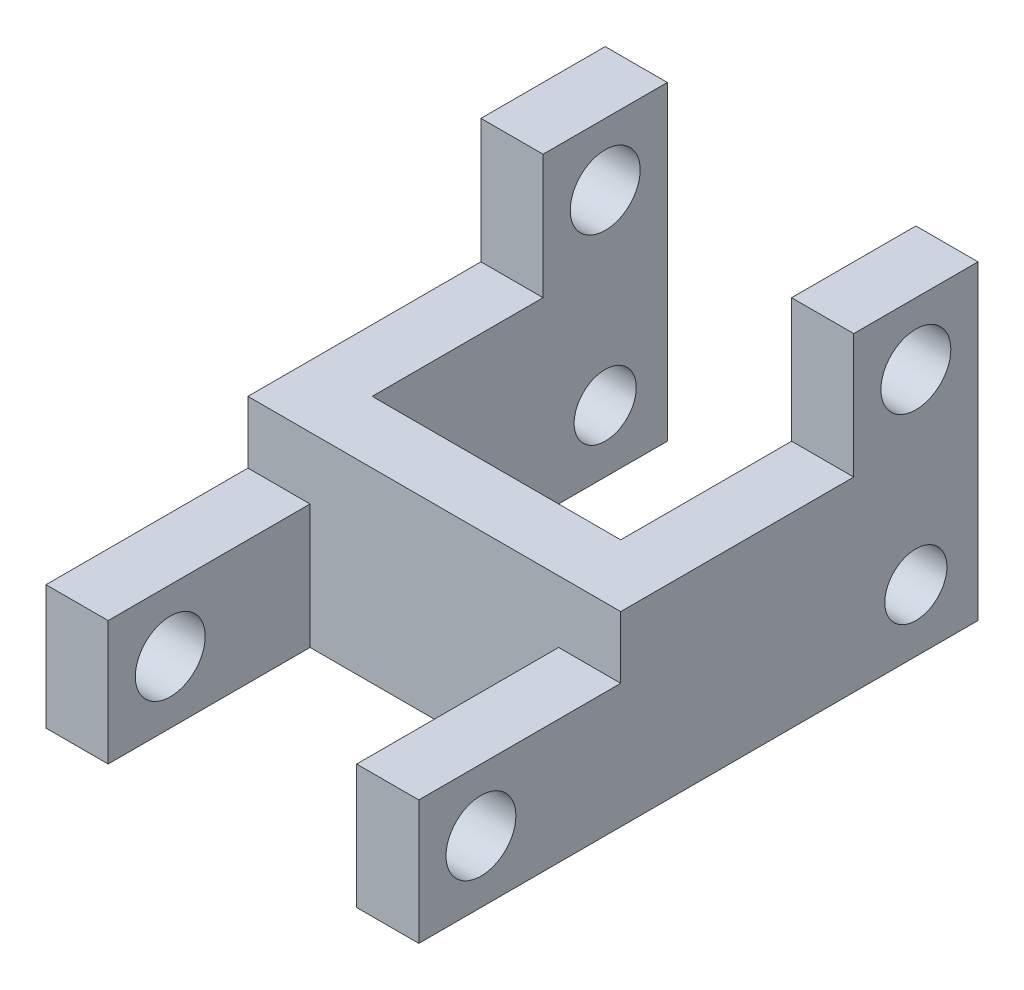
ISO-10303-21;
HEADER;
FILE_DESCRIPTION(('STEP AP214'),'2;1');
FILE_NAME('part.step','',(''),(''),'','','');
FILE_SCHEMA(('AUTOMOTIVE_DESIGN { 1 0 10303 214 1 1 1 1 }'));
ENDSEC;
DATA;
#1=APPLICATION_CONTEXT('core data for automotive mechanical design processes');
#2=APPLICATION_PROTOCOL_DEFINITION('international standard','automotive_design',2000,#1);
#3=PRODUCT_CONTEXT('',#1,'mechanical');
#4=PRODUCT('Part','Part','',(#3));
#5=PRODUCT_RELATED_PRODUCT_CATEGORY('part','',(#4));
#6=PRODUCT_DEFINITION_FORMATION('','',#4);
#7=PRODUCT_DEFINITION_CONTEXT('part definition',#1,'design');
#8=PRODUCT_DEFINITION('design','',#6,#7);
#9=PRODUCT_DEFINITION_SHAPE('','',#8);
#10=(LENGTH_UNIT() NAMED_UNIT(*) SI_UNIT(.MILLI.,.METRE.));
#11=(NAMED_UNIT(*) PLANE_ANGLE_UNIT() SI_UNIT($,.RADIAN.));
#12=(NAMED_UNIT(*) SI_UNIT($,.STERADIAN.) SOLID_ANGLE_UNIT());
#13=UNCERTAINTY_MEASURE_WITH_UNIT(LENGTH_MEASURE(1.E-05),#10,'distance_accuracy_value','');
#14=(GEOMETRIC_REPRESENTATION_CONTEXT(3) GLOBAL_UNCERTAINTY_ASSIGNED_CONTEXT((#13)) GLOBAL_UNIT_ASSIGNED_CONTEXT((#10,
#11,#12)) REPRESENTATION_CONTEXT('',''));
#15=CARTESIAN_POINT('',(0.,0.,0.));
#16=DIRECTION('',(0.,0.,1.));
#17=DIRECTION('',(1.,0.,0.));
#18=AXIS2_PLACEMENT_3D('',#15,#16,#17);
#19=CARTESIAN_POINT('',(0.,0.,0.));
#20=DIRECTION('',(1.,0.,0.));
#21=DIRECTION('',(0.,0.,-1.));
#22=AXIS2_PLACEMENT_3D('',#19,#20,#21);
#23=PLANE('',#22);
#24=CARTESIAN_POINT('',(0.,76.2,-177.8));
#25=DIRECTION('',(1.,0.,0.));
#26=DIRECTION('',(0.,0.,-1.));
#27=AXIS2_PLACEMENT_3D('',#24,#25,#26);
#28=CIRCLE('',#27,14.2875);
#29=CARTESIAN_POINT('',(0.,76.2,-192.0875));
#30=VERTEX_POINT('',#29);
#31=EDGE_CURVE('E335',#30,#30,#28,.T.);
#32=ORIENTED_EDGE('',*,*,#31,.T.);
#33=EDGE_LOOP('',(#32));
#34=FACE_BOUND('',#33,.T.);
#35=CARTESIAN_POINT('',(0.,0.,-177.8));
#36=DIRECTION('',(1.,0.,0.));
#37=DIRECTION('',(0.,0.,-1.));
#38=AXIS2_PLACEMENT_3D('',#35,#36,#37);
#39=CIRCLE('',#38,12.7);
#40=CARTESIAN_POINT('',(0.,0.,-190.5));
#41=VERTEX_POINT('',#40);
#42=EDGE_CURVE('E338',#41,#41,#39,.T.);
#43=ORIENTED_EDGE('',*,*,#42,.T.);
#44=EDGE_LOOP('',(#43));
#45=FACE_BOUND('',#44,.T.);
#46=DIRECTION('',(0.,-1.,0.));
#47=VECTOR('',#46,1.);
#48=CARTESIAN_POINT('',(0.,0.,-82.55));
#49=LINE('',#48,#47);
#50=CARTESIAN_POINT('',(0.,50.8,-82.55));
#51=VERTEX_POINT('',#50);
#52=CARTESIAN_POINT('',(0.,-25.4,-82.55));
#53=VERTEX_POINT('',#52);
#54=EDGE_CURVE('E296',#51,#53,#49,.T.);
#55=ORIENTED_EDGE('',*,*,#54,.F.);
#56=DIRECTION('',(0.,0.,-1.));
#57=VECTOR('',#56,1.);
#58=CARTESIAN_POINT('',(0.,50.8,0.));
#59=LINE('',#58,#57);
#60=CARTESIAN_POINT('',(0.,50.8,-152.4));
#61=VERTEX_POINT('',#60);
#62=EDGE_CURVE('E344',#51,#61,#59,.T.);
#63=ORIENTED_EDGE('',*,*,#62,.T.);
#64=DIRECTION('',(0.,1.,0.));
#65=VECTOR('',#64,1.);
#66=CARTESIAN_POINT('',(0.,0.,-152.4));
#67=LINE('',#66,#65);
#68=CARTESIAN_POINT('',(0.,101.6,-152.4));
#69=VERTEX_POINT('',#68);
#70=EDGE_CURVE('E347',#61,#69,#67,.T.);
#71=ORIENTED_EDGE('',*,*,#70,.T.);
#72=DIRECTION('',(0.,0.,1.));
#73=VECTOR('',#72,1.);
#74=CARTESIAN_POINT('',(0.,101.6,0.));
#75=LINE('',#74,#73);
#76=CARTESIAN_POINT('',(0.,101.6,-203.2));
#77=VERTEX_POINT('',#76);
#78=EDGE_CURVE('E351',#77,#69,#75,.T.);
#79=ORIENTED_EDGE('',*,*,#78,.F.);
#80=DIRECTION('',(0.,1.,0.));
#81=VECTOR('',#80,1.);
#82=CARTESIAN_POINT('',(0.,0.,-203.2));
#83=LINE('',#82,#81);
#84=CARTESIAN_POINT('',(0.,-25.4,-203.2));
#85=VERTEX_POINT('',#84);
#86=EDGE_CURVE('E320',#85,#77,#83,.T.);
#87=ORIENTED_EDGE('',*,*,#86,.F.);
#88=DIRECTION('',(0.,0.,-1.));
#89=VECTOR('',#88,1.);
#90=CARTESIAN_POINT('',(0.,-25.4,0.));
#91=LINE('',#90,#89);
#92=EDGE_CURVE('E309',#53,#85,#91,.T.);
#93=ORIENTED_EDGE('',*,*,#92,.F.);
#94=EDGE_LOOP('',(#55,#63,#71,#79,#87,#93));
#95=FACE_BOUND('',#94,.T.);
#96=ADVANCED_FACE('F35',(#34,#45,#95),#23,.F.);
#97=CARTESIAN_POINT('',(25.4,-25.4,0.));
#98=DIRECTION('',(0.,1.,0.));
#99=DIRECTION('',(0.,0.,1.));
#100=AXIS2_PLACEMENT_3D('',#97,#98,#99);
#101=PLANE('',#100);
#102=CARTESIAN_POINT('',(0.,-25.4,25.4));
#103=VERTEX_POINT('',#102);
#104=CARTESIAN_POINT('',(0.,-25.4,-57.15));
#105=VERTEX_POINT('',#104);
#106=EDGE_CURVE('E270',#103,#105,#91,.T.);
#107=ORIENTED_EDGE('',*,*,#106,.T.);
#108=DIRECTION('',(1.,0.,0.));
#109=VECTOR('',#108,1.);
#110=CARTESIAN_POINT('',(-101.6,-25.4,-57.15));
#111=LINE('',#110,#109);
#112=CARTESIAN_POINT('',(-101.6,-25.4,-57.15));
#113=VERTEX_POINT('',#112);
#114=EDGE_CURVE('E268',#113,#105,#111,.T.);
#115=ORIENTED_EDGE('',*,*,#114,.F.);
#116=DIRECTION('',(0.,0.,-1.));
#117=VECTOR('',#116,1.);
#118=CARTESIAN_POINT('',(-101.6,-25.4,0.));
#119=LINE('',#118,#117);
#120=CARTESIAN_POINT('',(-101.6,-25.4,25.4));
#121=VERTEX_POINT('',#120);
#122=EDGE_CURVE('E222',#121,#113,#119,.T.);
#123=ORIENTED_EDGE('',*,*,#122,.F.);
#124=DIRECTION('',(1.,0.,0.));
#125=VECTOR('',#124,1.);
#126=CARTESIAN_POINT('',(-127.,-25.4,25.4));
#127=LINE('',#126,#125);
#128=CARTESIAN_POINT('',(-127.,-25.4,25.4));
#129=VERTEX_POINT('',#128);
#130=EDGE_CURVE('E212',#129,#121,#127,.T.);
#131=ORIENTED_EDGE('',*,*,#130,.F.);
#132=DIRECTION('',(0.,0.,-1.));
#133=VECTOR('',#132,1.);
#134=CARTESIAN_POINT('',(-127.,-25.4,0.));
#135=LINE('',#134,#133);
#136=CARTESIAN_POINT('',(-127.,-25.4,-203.2));
#137=VERTEX_POINT('',#136);
#138=EDGE_CURVE('E187',#129,#137,#135,.T.);
#139=ORIENTED_EDGE('',*,*,#138,.T.);
#140=DIRECTION('',(1.,0.,0.));
#141=VECTOR('',#140,1.);
#142=CARTESIAN_POINT('',(-127.,-25.4,-203.2));
#143=LINE('',#142,#141);
#144=CARTESIAN_POINT('',(-101.6,-25.4,-203.2));
#145=VERTEX_POINT('',#144);
#146=EDGE_CURVE('E253',#137,#145,#143,.T.);
#147=ORIENTED_EDGE('',*,*,#146,.T.);
#148=CARTESIAN_POINT('',(-101.6,-25.4,-82.55));
#149=VERTEX_POINT('',#148);
#150=EDGE_CURVE('E226',#149,#145,#119,.T.);
#151=ORIENTED_EDGE('',*,*,#150,.F.);
#152=DIRECTION('',(1.,0.,0.));
#153=VECTOR('',#152,1.);
#154=CARTESIAN_POINT('',(-101.6,-25.4,-82.55));
#155=LINE('',#154,#153);
#156=EDGE_CURVE('E272',#149,#53,#155,.T.);
#157=ORIENTED_EDGE('',*,*,#156,.T.);
#158=ORIENTED_EDGE('',*,*,#92,.T.);
#159=DIRECTION('',(-1.,0.,0.));
#160=VECTOR('',#159,1.);
#161=CARTESIAN_POINT('',(25.4,-25.4,-203.2));
#162=LINE('',#161,#160);
#163=CARTESIAN_POINT('',(25.4,-25.4,-203.2));
#164=VERTEX_POINT('',#163);
#165=EDGE_CURVE('E11',#164,#85,#162,.T.);
#166=ORIENTED_EDGE('',*,*,#165,.F.);
#167=DIRECTION('',(0.,0.,-1.));
#168=VECTOR('',#167,1.);
#169=CARTESIAN_POINT('',(25.4,-25.4,0.));
#170=LINE('',#169,#168);
#171=CARTESIAN_POINT('',(25.4,-25.4,25.4));
#172=VERTEX_POINT('',#171);
#173=EDGE_CURVE('E720',#172,#164,#170,.T.);
#174=ORIENTED_EDGE('',*,*,#173,.F.);
#175=DIRECTION('',(-1.,0.,0.));
#176=VECTOR('',#175,1.);
#177=CARTESIAN_POINT('',(25.4,-25.4,25.4));
#178=LINE('',#177,#176);
#179=EDGE_CURVE('E333',#172,#103,#178,.T.);
#180=ORIENTED_EDGE('',*,*,#179,.T.);
#181=EDGE_LOOP('',(#107,#115,#123,#131,#139,#147,#151,#157,#158,#166,#174,#180));
#182=FACE_BOUND('',#181,.T.);
#183=ADVANCED_FACE('F266',(#182),#101,.F.);
#184=CARTESIAN_POINT('',(25.4,0.,-203.2));
#185=DIRECTION('',(0.,0.,1.));
#186=DIRECTION('',(1.,0.,0.));
#187=AXIS2_PLACEMENT_3D('',#184,#185,#186);
#188=PLANE('',#187);
#189=ORIENTED_EDGE('',*,*,#86,.T.);
#190=DIRECTION('',(-1.,0.,0.));
#191=VECTOR('',#190,1.);
#192=CARTESIAN_POINT('',(25.4,101.6,-203.2));
#193=LINE('',#192,#191);
#194=CARTESIAN_POINT('',(25.4,101.6,-203.2));
#195=VERTEX_POINT('',#194);
#196=EDGE_CURVE('E45',#195,#77,#193,.T.);
#197=ORIENTED_EDGE('',*,*,#196,.F.);
#198=DIRECTION('',(0.,1.,0.));
#199=VECTOR('',#198,1.);
#200=CARTESIAN_POINT('',(25.4,0.,-203.2));
#201=LINE('',#200,#199);
#202=EDGE_CURVE('E721',#164,#195,#201,.T.);
#203=ORIENTED_EDGE('',*,*,#202,.F.);
#204=ORIENTED_EDGE('',*,*,#165,.T.);
#205=EDGE_LOOP('',(#189,#197,#203,#204));
#206=FACE_BOUND('',#205,.T.);
#207=ADVANCED_FACE('F360',(#206),#188,.F.);
#208=CARTESIAN_POINT('',(25.4,101.6,0.));
#209=DIRECTION('',(0.,-1.,0.));
#210=DIRECTION('',(0.,0.,-1.));
#211=AXIS2_PLACEMENT_3D('',#208,#209,#210);
#212=PLANE('',#211);
#213=ORIENTED_EDGE('',*,*,#78,.T.);
#214=DIRECTION('',(-1.,0.,0.));
#215=VECTOR('',#214,1.);
#216=CARTESIAN_POINT('',(25.4,101.6,-152.4));
#217=LINE('',#216,#215);
#218=CARTESIAN_POINT('',(25.4,101.6,-152.4));
#219=VERTEX_POINT('',#218);
#220=EDGE_CURVE('E328',#219,#69,#217,.T.);
#221=ORIENTED_EDGE('',*,*,#220,.F.);
#222=DIRECTION('',(0.,0.,1.));
#223=VECTOR('',#222,1.);
#224=CARTESIAN_POINT('',(25.4,101.6,0.));
#225=LINE('',#224,#223);
#226=EDGE_CURVE('E364',#195,#219,#225,.T.);
#227=ORIENTED_EDGE('',*,*,#226,.F.);
#228=ORIENTED_EDGE('',*,*,#196,.T.);
#229=EDGE_LOOP('',(#213,#221,#227,#228));
#230=FACE_BOUND('',#229,.T.);
#231=ADVANCED_FACE('F363',(#230),#212,.F.);
#232=CARTESIAN_POINT('',(25.4,0.,-152.4));
#233=DIRECTION('',(0.,0.,1.));
#234=DIRECTION('',(1.,0.,0.));
#235=AXIS2_PLACEMENT_3D('',#232,#233,#234);
#236=PLANE('',#235);
#237=ORIENTED_EDGE('',*,*,#70,.F.);
#238=DIRECTION('',(-1.,0.,0.));
#239=VECTOR('',#238,1.);
#240=CARTESIAN_POINT('',(25.4,50.8,-152.4));
#241=LINE('',#240,#239);
#242=CARTESIAN_POINT('',(25.4,50.8,-152.4));
#243=VERTEX_POINT('',#242);
#244=EDGE_CURVE('E330',#243,#61,#241,.T.);
#245=ORIENTED_EDGE('',*,*,#244,.F.);
#246=DIRECTION('',(0.,1.,0.));
#247=VECTOR('',#246,1.);
#248=CARTESIAN_POINT('',(25.4,0.,-152.4));
#249=LINE('',#248,#247);
#250=EDGE_CURVE('E410',#243,#219,#249,.T.);
#251=ORIENTED_EDGE('',*,*,#250,.T.);
#252=ORIENTED_EDGE('',*,*,#220,.T.);
#253=EDGE_LOOP('',(#237,#245,#251,#252));
#254=FACE_BOUND('',#253,.T.);
#255=ADVANCED_FACE('F441',(#254),#236,.T.);
#256=CARTESIAN_POINT('',(25.4,50.8,0.));
#257=DIRECTION('',(0.,1.,0.));
#258=DIRECTION('',(0.,0.,1.));
#259=AXIS2_PLACEMENT_3D('',#256,#257,#258);
#260=PLANE('',#259);
#261=DIRECTION('',(1.,0.,0.));
#262=VECTOR('',#261,1.);
#263=CARTESIAN_POINT('',(-101.6,50.8,-57.15));
#264=LINE('',#263,#262);
#265=CARTESIAN_POINT('',(-127.,50.8,-57.15));
#266=VERTEX_POINT('',#265);
#267=CARTESIAN_POINT('',(25.4,50.8,-57.15));
#268=VERTEX_POINT('',#267);
#269=EDGE_CURVE('E273',#266,#268,#264,.T.);
#270=ORIENTED_EDGE('',*,*,#269,.T.);
#271=DIRECTION('',(0.,0.,-1.));
#272=VECTOR('',#271,1.);
#273=CARTESIAN_POINT('',(25.4,50.8,0.));
#274=LINE('',#273,#272);
#275=EDGE_CURVE('E408',#268,#243,#274,.T.);
#276=ORIENTED_EDGE('',*,*,#275,.T.);
#277=ORIENTED_EDGE('',*,*,#244,.T.);
#278=ORIENTED_EDGE('',*,*,#62,.F.);
#279=DIRECTION('',(1.,0.,0.));
#280=VECTOR('',#279,1.);
#281=CARTESIAN_POINT('',(-101.6,50.8,-82.55));
#282=LINE('',#281,#280);
#283=CARTESIAN_POINT('',(-101.6,50.8,-82.55));
#284=VERTEX_POINT('',#283);
#285=EDGE_CURVE('E276',#284,#51,#282,.T.);
#286=ORIENTED_EDGE('',*,*,#285,.F.);
#287=DIRECTION('',(0.,0.,-1.));
#288=VECTOR('',#287,1.);
#289=CARTESIAN_POINT('',(-101.6,50.8,0.));
#290=LINE('',#289,#288);
#291=CARTESIAN_POINT('',(-101.6,50.8,-152.4));
#292=VERTEX_POINT('',#291);
#293=EDGE_CURVE('E217',#284,#292,#290,.T.);
#294=ORIENTED_EDGE('',*,*,#293,.T.);
#295=DIRECTION('',(1.,0.,0.));
#296=VECTOR('',#295,1.);
#297=CARTESIAN_POINT('',(-127.,50.8,-152.4));
#298=LINE('',#297,#296);
#299=CARTESIAN_POINT('',(-127.,50.8,-152.4));
#300=VERTEX_POINT('',#299);
#301=EDGE_CURVE('E247',#300,#292,#298,.T.);
#302=ORIENTED_EDGE('',*,*,#301,.F.);
#303=DIRECTION('',(0.,0.,-1.));
#304=VECTOR('',#303,1.);
#305=CARTESIAN_POINT('',(-127.,50.8,0.));
#306=LINE('',#305,#304);
#307=EDGE_CURVE('E188',#266,#300,#306,.T.);
#308=ORIENTED_EDGE('',*,*,#307,.F.);
#309=EDGE_LOOP('',(#270,#276,#277,#278,#286,#294,#302,#308));
#310=FACE_BOUND('',#309,.T.);
#311=ADVANCED_FACE('F436',(#310),#260,.T.);
#312=CARTESIAN_POINT('',(25.4,0.,-177.8));
#313=DIRECTION('',(-1.,0.,0.));
#314=DIRECTION('',(0.,0.,1.));
#315=AXIS2_PLACEMENT_3D('',#312,#313,#314);
#316=CYLINDRICAL_SURFACE('',#315,12.7);
#317=CARTESIAN_POINT('',(25.4,0.,-177.8));
#318=DIRECTION('',(1.,0.,0.));
#319=DIRECTION('',(0.,0.,-1.));
#320=AXIS2_PLACEMENT_3D('',#317,#318,#319);
#321=CIRCLE('',#320,12.7);
#322=CARTESIAN_POINT('',(25.4,0.,-190.5));
#323=VERTEX_POINT('',#322);
#324=EDGE_CURVE('E414',#323,#323,#321,.T.);
#325=ORIENTED_EDGE('',*,*,#324,.T.);
#326=EDGE_LOOP('',(#325));
#327=FACE_BOUND('',#326,.T.);
#328=ORIENTED_EDGE('',*,*,#42,.F.);
#329=EDGE_LOOP('',(#328));
#330=FACE_BOUND('',#329,.T.);
#331=ADVANCED_FACE('F433',(#327,#330),#316,.F.);
#332=CARTESIAN_POINT('',(25.4,0.,25.4));
#333=DIRECTION('',(0.,0.,1.));
#334=DIRECTION('',(0.,-1.,0.));
#335=AXIS2_PLACEMENT_3D('',#332,#333,#334);
#336=PLANE('',#335);
#337=DIRECTION('',(1.,0.,0.));
#338=VECTOR('',#337,1.);
#339=CARTESIAN_POINT('',(-127.,25.4,25.4));
#340=LINE('',#339,#338);
#341=CARTESIAN_POINT('',(0.,25.4,25.4));
#342=VERTEX_POINT('',#341);
#343=CARTESIAN_POINT('',(25.4,25.4,25.4));
#344=VERTEX_POINT('',#343);
#345=EDGE_CURVE('E181',#342,#344,#340,.T.);
#346=ORIENTED_EDGE('',*,*,#345,.F.);
#347=DIRECTION('',(0.,1.,0.));
#348=VECTOR('',#347,1.);
#349=CARTESIAN_POINT('',(0.,0.,25.4));
#350=LINE('',#349,#348);
#351=EDGE_CURVE('E341',#103,#342,#350,.T.);
#352=ORIENTED_EDGE('',*,*,#351,.F.);
#353=ORIENTED_EDGE('',*,*,#179,.F.);
#354=DIRECTION('',(0.,1.,0.));
#355=VECTOR('',#354,1.);
#356=CARTESIAN_POINT('',(25.4,0.,25.4));
#357=LINE('',#356,#355);
#358=EDGE_CURVE('E394',#172,#344,#357,.T.);
#359=ORIENTED_EDGE('',*,*,#358,.T.);
#360=EDGE_LOOP('',(#346,#352,#353,#359));
#361=FACE_BOUND('',#360,.T.);
#362=ADVANCED_FACE('F390',(#361),#336,.T.);
#363=CARTESIAN_POINT('',(25.4,0.,0.));
#364=DIRECTION('',(-1.,0.,0.));
#365=DIRECTION('',(0.,0.,1.));
#366=AXIS2_PLACEMENT_3D('',#363,#364,#365);
#367=CYLINDRICAL_SURFACE('',#366,14.2875);
#368=CARTESIAN_POINT('',(25.4,0.,0.));
#369=DIRECTION('',(1.,0.,0.));
#370=DIRECTION('',(0.,0.,-1.));
#371=AXIS2_PLACEMENT_3D('',#368,#369,#370);
#372=CIRCLE('',#371,14.2875);
#373=CARTESIAN_POINT('',(25.4,0.,-14.2875));
#374=VERTEX_POINT('',#373);
#375=EDGE_CURVE('E293',#374,#374,#372,.T.);
#376=ORIENTED_EDGE('',*,*,#375,.T.);
#377=EDGE_LOOP('',(#376));
#378=FACE_BOUND('',#377,.T.);
#379=CARTESIAN_POINT('',(0.,0.,0.));
#380=DIRECTION('',(1.,0.,0.));
#381=DIRECTION('',(0.,0.,-1.));
#382=AXIS2_PLACEMENT_3D('',#379,#380,#381);
#383=CIRCLE('',#382,14.2875);
#384=CARTESIAN_POINT('',(0.,0.,-14.2875));
#385=VERTEX_POINT('',#384);
#386=EDGE_CURVE('E303',#385,#385,#383,.T.);
#387=ORIENTED_EDGE('',*,*,#386,.F.);
#388=EDGE_LOOP('',(#387));
#389=FACE_BOUND('',#388,.T.);
#390=ADVANCED_FACE('F37',(#378,#389),#367,.F.);
#391=CARTESIAN_POINT('',(25.4,76.2,-177.8));
#392=DIRECTION('',(-1.,0.,0.));
#393=DIRECTION('',(0.,0.,1.));
#394=AXIS2_PLACEMENT_3D('',#391,#392,#393);
#395=CYLINDRICAL_SURFACE('',#394,14.2875);
#396=CARTESIAN_POINT('',(25.4,76.2,-177.8));
#397=DIRECTION('',(1.,0.,0.));
#398=DIRECTION('',(0.,0.,-1.));
#399=AXIS2_PLACEMENT_3D('',#396,#397,#398);
#400=CIRCLE('',#399,14.2875);
#401=CARTESIAN_POINT('',(25.4,76.2,-192.0875));
#402=VERTEX_POINT('',#401);
#403=EDGE_CURVE('E316',#402,#402,#400,.T.);
#404=ORIENTED_EDGE('',*,*,#403,.T.);
#405=EDGE_LOOP('',(#404));
#406=FACE_BOUND('',#405,.T.);
#407=ORIENTED_EDGE('',*,*,#31,.F.);
#408=EDGE_LOOP('',(#407));
#409=FACE_BOUND('',#408,.T.);
#410=ADVANCED_FACE('F384',(#406,#409),#395,.F.);
#411=CARTESIAN_POINT('',(25.4,0.,0.));
#412=DIRECTION('',(1.,0.,0.));
#413=DIRECTION('',(0.,0.,-1.));
#414=AXIS2_PLACEMENT_3D('',#411,#412,#413);
#415=PLANE('',#414);
#416=DIRECTION('',(0.,1.,0.));
#417=VECTOR('',#416,1.);
#418=CARTESIAN_POINT('',(25.4,50.8,-57.15));
#419=LINE('',#418,#417);
#420=CARTESIAN_POINT('',(25.4,25.4,-57.15));
#421=VERTEX_POINT('',#420);
#422=EDGE_CURVE('E171',#421,#268,#419,.T.);
#423=ORIENTED_EDGE('',*,*,#422,.F.);
#424=DIRECTION('',(0.,0.,-1.));
#425=VECTOR('',#424,1.);
#426=CARTESIAN_POINT('',(25.4,25.4,25.4));
#427=LINE('',#426,#425);
#428=EDGE_CURVE('E403',#344,#421,#427,.T.);
#429=ORIENTED_EDGE('',*,*,#428,.F.);
#430=ORIENTED_EDGE('',*,*,#358,.F.);
#431=ORIENTED_EDGE('',*,*,#173,.T.);
#432=ORIENTED_EDGE('',*,*,#202,.T.);
#433=ORIENTED_EDGE('',*,*,#226,.T.);
#434=ORIENTED_EDGE('',*,*,#250,.F.);
#435=ORIENTED_EDGE('',*,*,#275,.F.);
#436=EDGE_LOOP('',(#423,#429,#430,#431,#432,#433,#434,#435));
#437=FACE_BOUND('',#436,.T.);
#438=ORIENTED_EDGE('',*,*,#375,.F.);
#439=EDGE_LOOP('',(#438));
#440=FACE_BOUND('',#439,.T.);
#441=ORIENTED_EDGE('',*,*,#324,.F.);
#442=EDGE_LOOP('',(#441));
#443=FACE_BOUND('',#442,.T.);
#444=ORIENTED_EDGE('',*,*,#403,.F.);
#445=EDGE_LOOP('',(#444));
#446=FACE_BOUND('',#445,.T.);
#447=ADVANCED_FACE('F377',(#437,#440,#443,#446),#415,.T.);
#448=ORIENTED_EDGE('',*,*,#386,.T.);
#449=EDGE_LOOP('',(#448));
#450=FACE_BOUND('',#449,.T.);
#451=ORIENTED_EDGE('',*,*,#351,.T.);
#452=DIRECTION('',(0.,0.,-1.));
#453=VECTOR('',#452,1.);
#454=CARTESIAN_POINT('',(0.,25.4,0.));
#455=LINE('',#454,#453);
#456=CARTESIAN_POINT('',(0.,25.4,-57.15));
#457=VERTEX_POINT('',#456);
#458=EDGE_CURVE('E220',#342,#457,#455,.T.);
#459=ORIENTED_EDGE('',*,*,#458,.T.);
#460=DIRECTION('',(0.,-1.,0.));
#461=VECTOR('',#460,1.);
#462=CARTESIAN_POINT('',(0.,0.,-57.15));
#463=LINE('',#462,#461);
#464=EDGE_CURVE('E39',#457,#105,#463,.T.);
#465=ORIENTED_EDGE('',*,*,#464,.T.);
#466=ORIENTED_EDGE('',*,*,#106,.F.);
#467=EDGE_LOOP('',(#451,#459,#465,#466));
#468=FACE_BOUND('',#467,.T.);
#469=ADVANCED_FACE('F368',(#450,#468),#23,.F.);
#470=CARTESIAN_POINT('',(-101.6,0.,-82.55));
#471=DIRECTION('',(0.,0.,1.));
#472=DIRECTION('',(1.,0.,0.));
#473=AXIS2_PLACEMENT_3D('',#470,#471,#472);
#474=PLANE('',#473);
#475=ORIENTED_EDGE('',*,*,#54,.T.);
#476=ORIENTED_EDGE('',*,*,#156,.F.);
#477=DIRECTION('',(0.,-1.,0.));
#478=VECTOR('',#477,1.);
#479=CARTESIAN_POINT('',(-101.6,0.,-82.55));
#480=LINE('',#479,#478);
#481=EDGE_CURVE('E278',#284,#149,#480,.T.);
#482=ORIENTED_EDGE('',*,*,#481,.F.);
#483=ORIENTED_EDGE('',*,*,#285,.T.);
#484=EDGE_LOOP('',(#475,#476,#482,#483));
#485=FACE_BOUND('',#484,.T.);
#486=ADVANCED_FACE('F376',(#485),#474,.F.);
#487=CARTESIAN_POINT('',(-101.6,0.,-57.15));
#488=DIRECTION('',(0.,0.,1.));
#489=DIRECTION('',(0.,-1.,0.));
#490=AXIS2_PLACEMENT_3D('',#487,#488,#489);
#491=PLANE('',#490);
#492=ORIENTED_EDGE('',*,*,#464,.F.);
#493=DIRECTION('',(1.,0.,0.));
#494=VECTOR('',#493,1.);
#495=CARTESIAN_POINT('',(-127.,25.4,-57.15));
#496=LINE('',#495,#494);
#497=EDGE_CURVE('E53',#457,#421,#496,.T.);
#498=ORIENTED_EDGE('',*,*,#497,.T.);
#499=ORIENTED_EDGE('',*,*,#422,.T.);
#500=ORIENTED_EDGE('',*,*,#269,.F.);
#501=DIRECTION('',(0.,1.,0.));
#502=VECTOR('',#501,1.);
#503=CARTESIAN_POINT('',(-127.,50.8,-57.15));
#504=LINE('',#503,#502);
#505=CARTESIAN_POINT('',(-127.,25.4,-57.15));
#506=VERTEX_POINT('',#505);
#507=EDGE_CURVE('E61',#506,#266,#504,.T.);
#508=ORIENTED_EDGE('',*,*,#507,.F.);
#509=CARTESIAN_POINT('',(-101.6,25.4,-57.15));
#510=VERTEX_POINT('',#509);
#511=EDGE_CURVE('E168',#506,#510,#496,.T.);
#512=ORIENTED_EDGE('',*,*,#511,.T.);
#513=DIRECTION('',(0.,-1.,0.));
#514=VECTOR('',#513,1.);
#515=CARTESIAN_POINT('',(-101.6,0.,-57.15));
#516=LINE('',#515,#514);
#517=EDGE_CURVE('E286',#510,#113,#516,.T.);
#518=ORIENTED_EDGE('',*,*,#517,.T.);
#519=ORIENTED_EDGE('',*,*,#114,.T.);
#520=EDGE_LOOP('',(#492,#498,#499,#500,#508,#512,#518,#519));
#521=FACE_BOUND('',#520,.T.);
#522=ADVANCED_FACE('F382',(#521),#491,.T.);
#523=CARTESIAN_POINT('',(-101.6,0.,0.));
#524=DIRECTION('',(1.,0.,0.));
#525=DIRECTION('',(0.,0.,-1.));
#526=AXIS2_PLACEMENT_3D('',#523,#524,#525);
#527=PLANE('',#526);
#528=DIRECTION('',(0.,0.,-1.));
#529=VECTOR('',#528,1.);
#530=CARTESIAN_POINT('',(-101.6,25.4,0.));
#531=LINE('',#530,#529);
#532=CARTESIAN_POINT('',(-101.6,25.4,25.4));
#533=VERTEX_POINT('',#532);
#534=EDGE_CURVE('E264',#533,#510,#531,.T.);
#535=ORIENTED_EDGE('',*,*,#534,.F.);
#536=DIRECTION('',(0.,1.,0.));
#537=VECTOR('',#536,1.);
#538=CARTESIAN_POINT('',(-101.6,0.,25.4));
#539=LINE('',#538,#537);
#540=EDGE_CURVE('E180',#121,#533,#539,.T.);
#541=ORIENTED_EDGE('',*,*,#540,.F.);
#542=ORIENTED_EDGE('',*,*,#122,.T.);
#543=ORIENTED_EDGE('',*,*,#517,.F.);
#544=EDGE_LOOP('',(#535,#541,#542,#543));
#545=FACE_BOUND('',#544,.T.);
#546=CARTESIAN_POINT('',(-101.6,0.,0.));
#547=DIRECTION('',(1.,0.,0.));
#548=DIRECTION('',(0.,0.,-1.));
#549=AXIS2_PLACEMENT_3D('',#546,#547,#548);
#550=CIRCLE('',#549,14.2875);
#551=CARTESIAN_POINT('',(-101.6,0.,-14.2875));
#552=VERTEX_POINT('',#551);
#553=EDGE_CURVE('E192',#552,#552,#550,.T.);
#554=ORIENTED_EDGE('',*,*,#553,.F.);
#555=EDGE_LOOP('',(#554));
#556=FACE_BOUND('',#555,.T.);
#557=ADVANCED_FACE('F260',(#545,#556),#527,.T.);
#558=CARTESIAN_POINT('',(-127.,0.,-152.4));
#559=DIRECTION('',(0.,0.,-1.));
#560=DIRECTION('',(-1.,0.,0.));
#561=AXIS2_PLACEMENT_3D('',#558,#559,#560);
#562=PLANE('',#561);
#563=DIRECTION('',(0.,1.,0.));
#564=VECTOR('',#563,1.);
#565=CARTESIAN_POINT('',(-101.6,0.,-152.4));
#566=LINE('',#565,#564);
#567=CARTESIAN_POINT('',(-101.6,101.6,-152.4));
#568=VERTEX_POINT('',#567);
#569=EDGE_CURVE('E236',#292,#568,#566,.T.);
#570=ORIENTED_EDGE('',*,*,#569,.T.);
#571=DIRECTION('',(1.,0.,0.));
#572=VECTOR('',#571,1.);
#573=CARTESIAN_POINT('',(-127.,101.6,-152.4));
#574=LINE('',#573,#572);
#575=CARTESIAN_POINT('',(-127.,101.6,-152.4));
#576=VERTEX_POINT('',#575);
#577=EDGE_CURVE('E250',#576,#568,#574,.T.);
#578=ORIENTED_EDGE('',*,*,#577,.F.);
#579=DIRECTION('',(0.,1.,0.));
#580=VECTOR('',#579,1.);
#581=CARTESIAN_POINT('',(-127.,0.,-152.4));
#582=LINE('',#581,#580);
#583=EDGE_CURVE('E201',#300,#576,#582,.T.);
#584=ORIENTED_EDGE('',*,*,#583,.F.);
#585=ORIENTED_EDGE('',*,*,#301,.T.);
#586=EDGE_LOOP('',(#570,#578,#584,#585));
#587=FACE_BOUND('',#586,.T.);
#588=ADVANCED_FACE('F509',(#587),#562,.F.);
#589=CARTESIAN_POINT('',(-127.,101.6,0.));
#590=DIRECTION('',(0.,1.,0.));
#591=DIRECTION('',(0.,0.,1.));
#592=AXIS2_PLACEMENT_3D('',#589,#590,#591);
#593=PLANE('',#592);
#594=DIRECTION('',(0.,0.,1.));
#595=VECTOR('',#594,1.);
#596=CARTESIAN_POINT('',(-101.6,101.6,0.));
#597=LINE('',#596,#595);
#598=CARTESIAN_POINT('',(-101.6,101.6,-203.2));
#599=VERTEX_POINT('',#598);
#600=EDGE_CURVE('E233',#599,#568,#597,.T.);
#601=ORIENTED_EDGE('',*,*,#600,.F.);
#602=DIRECTION('',(1.,0.,0.));
#603=VECTOR('',#602,1.);
#604=CARTESIAN_POINT('',(-127.,101.6,-203.2));
#605=LINE('',#604,#603);
#606=CARTESIAN_POINT('',(-127.,101.6,-203.2));
#607=VERTEX_POINT('',#606);
#608=EDGE_CURVE('E252',#607,#599,#605,.T.);
#609=ORIENTED_EDGE('',*,*,#608,.F.);
#610=DIRECTION('',(0.,0.,1.));
#611=VECTOR('',#610,1.);
#612=CARTESIAN_POINT('',(-127.,101.6,0.));
#613=LINE('',#612,#611);
#614=EDGE_CURVE('E198',#607,#576,#613,.T.);
#615=ORIENTED_EDGE('',*,*,#614,.T.);
#616=ORIENTED_EDGE('',*,*,#577,.T.);
#617=EDGE_LOOP('',(#601,#609,#615,#616));
#618=FACE_BOUND('',#617,.T.);
#619=ADVANCED_FACE('F514',(#618),#593,.T.);
#620=CARTESIAN_POINT('',(-127.,0.,-203.2));
#621=DIRECTION('',(0.,0.,-1.));
#622=DIRECTION('',(-1.,0.,0.));
#623=AXIS2_PLACEMENT_3D('',#620,#621,#622);
#624=PLANE('',#623);
#625=DIRECTION('',(0.,1.,0.));
#626=VECTOR('',#625,1.);
#627=CARTESIAN_POINT('',(-101.6,0.,-203.2));
#628=LINE('',#627,#626);
#629=EDGE_CURVE('E225',#145,#599,#628,.T.);
#630=ORIENTED_EDGE('',*,*,#629,.F.);
#631=ORIENTED_EDGE('',*,*,#146,.F.);
#632=DIRECTION('',(0.,1.,0.));
#633=VECTOR('',#632,1.);
#634=CARTESIAN_POINT('',(-127.,0.,-203.2));
#635=LINE('',#634,#633);
#636=EDGE_CURVE('E190',#137,#607,#635,.T.);
#637=ORIENTED_EDGE('',*,*,#636,.T.);
#638=ORIENTED_EDGE('',*,*,#608,.T.);
#639=EDGE_LOOP('',(#630,#631,#637,#638));
#640=FACE_BOUND('',#639,.T.);
#641=ADVANCED_FACE('F526',(#640),#624,.T.);
#642=CARTESIAN_POINT('',(-127.,76.2,-177.8));
#643=DIRECTION('',(1.,0.,0.));
#644=DIRECTION('',(0.,0.,-1.));
#645=AXIS2_PLACEMENT_3D('',#642,#643,#644);
#646=CYLINDRICAL_SURFACE('',#645,14.2875);
#647=CARTESIAN_POINT('',(-127.,76.2,-177.8));
#648=DIRECTION('',(1.,0.,0.));
#649=DIRECTION('',(0.,0.,-1.));
#650=AXIS2_PLACEMENT_3D('',#647,#648,#649);
#651=CIRCLE('',#650,14.2875);
#652=CARTESIAN_POINT('',(-127.,76.2,-192.0875));
#653=VERTEX_POINT('',#652);
#654=EDGE_CURVE('E206',#653,#653,#651,.T.);
#655=ORIENTED_EDGE('',*,*,#654,.F.);
#656=EDGE_LOOP('',(#655));
#657=FACE_BOUND('',#656,.T.);
#658=CARTESIAN_POINT('',(-101.6,76.2,-177.8));
#659=DIRECTION('',(1.,0.,0.));
#660=DIRECTION('',(0.,0.,-1.));
#661=AXIS2_PLACEMENT_3D('',#658,#659,#660);
#662=CIRCLE('',#661,14.2875);
#663=CARTESIAN_POINT('',(-101.6,76.2,-192.0875));
#664=VERTEX_POINT('',#663);
#665=EDGE_CURVE('E242',#664,#664,#662,.T.);
#666=ORIENTED_EDGE('',*,*,#665,.T.);
#667=EDGE_LOOP('',(#666));
#668=FACE_BOUND('',#667,.T.);
#669=ADVANCED_FACE('F536',(#657,#668),#646,.F.);
#670=CARTESIAN_POINT('',(-127.,0.,-177.8));
#671=DIRECTION('',(1.,0.,0.));
#672=DIRECTION('',(0.,0.,-1.));
#673=AXIS2_PLACEMENT_3D('',#670,#671,#672);
#674=CYLINDRICAL_SURFACE('',#673,12.7);
#675=CARTESIAN_POINT('',(-127.,0.,-177.8));
#676=DIRECTION('',(1.,0.,0.));
#677=DIRECTION('',(0.,0.,-1.));
#678=AXIS2_PLACEMENT_3D('',#675,#676,#677);
#679=CIRCLE('',#678,12.7);
#680=CARTESIAN_POINT('',(-127.,0.,-190.5));
#681=VERTEX_POINT('',#680);
#682=EDGE_CURVE('E203',#681,#681,#679,.T.);
#683=ORIENTED_EDGE('',*,*,#682,.F.);
#684=EDGE_LOOP('',(#683));
#685=FACE_BOUND('',#684,.T.);
#686=CARTESIAN_POINT('',(-101.6,0.,-177.8));
#687=DIRECTION('',(1.,0.,0.));
#688=DIRECTION('',(0.,0.,-1.));
#689=AXIS2_PLACEMENT_3D('',#686,#687,#688);
#690=CIRCLE('',#689,12.7);
#691=CARTESIAN_POINT('',(-101.6,0.,-190.5));
#692=VERTEX_POINT('',#691);
#693=EDGE_CURVE('E239',#692,#692,#690,.T.);
#694=ORIENTED_EDGE('',*,*,#693,.T.);
#695=EDGE_LOOP('',(#694));
#696=FACE_BOUND('',#695,.T.);
#697=ADVANCED_FACE('F546',(#685,#696),#674,.F.);
#698=CARTESIAN_POINT('',(-127.,0.,25.4));
#699=DIRECTION('',(0.,0.,-1.));
#700=DIRECTION('',(0.,1.,0.));
#701=AXIS2_PLACEMENT_3D('',#698,#699,#700);
#702=PLANE('',#701);
#703=ORIENTED_EDGE('',*,*,#540,.T.);
#704=CARTESIAN_POINT('',(-127.,25.4,25.4));
#705=VERTEX_POINT('',#704);
#706=EDGE_CURVE('E166',#705,#533,#340,.T.);
#707=ORIENTED_EDGE('',*,*,#706,.F.);
#708=DIRECTION('',(0.,1.,0.));
#709=VECTOR('',#708,1.);
#710=CARTESIAN_POINT('',(-127.,0.,25.4));
#711=LINE('',#710,#709);
#712=EDGE_CURVE('E177',#129,#705,#711,.T.);
#713=ORIENTED_EDGE('',*,*,#712,.F.);
#714=ORIENTED_EDGE('',*,*,#130,.T.);
#715=EDGE_LOOP('',(#703,#707,#713,#714));
#716=FACE_BOUND('',#715,.T.);
#717=ADVANCED_FACE('F176',(#716),#702,.F.);
#718=CARTESIAN_POINT('',(-127.,0.,0.));
#719=DIRECTION('',(1.,0.,0.));
#720=DIRECTION('',(0.,0.,-1.));
#721=AXIS2_PLACEMENT_3D('',#718,#719,#720);
#722=CYLINDRICAL_SURFACE('',#721,14.2875);
#723=CARTESIAN_POINT('',(-127.,0.,0.));
#724=DIRECTION('',(1.,0.,0.));
#725=DIRECTION('',(0.,0.,-1.));
#726=AXIS2_PLACEMENT_3D('',#723,#724,#725);
#727=CIRCLE('',#726,14.2875);
#728=CARTESIAN_POINT('',(-127.,0.,-14.2875));
#729=VERTEX_POINT('',#728);
#730=EDGE_CURVE('E209',#729,#729,#727,.T.);
#731=ORIENTED_EDGE('',*,*,#730,.F.);
#732=EDGE_LOOP('',(#731));
#733=FACE_BOUND('',#732,.T.);
#734=ORIENTED_EDGE('',*,*,#553,.T.);
#735=EDGE_LOOP('',(#734));
#736=FACE_BOUND('',#735,.T.);
#737=ADVANCED_FACE('F563',(#733,#736),#722,.F.);
#738=CARTESIAN_POINT('',(-127.,0.,0.));
#739=DIRECTION('',(1.,0.,0.));
#740=DIRECTION('',(0.,0.,-1.));
#741=AXIS2_PLACEMENT_3D('',#738,#739,#740);
#742=PLANE('',#741);
#743=DIRECTION('',(0.,0.,-1.));
#744=VECTOR('',#743,1.);
#745=CARTESIAN_POINT('',(-127.,25.4,25.4));
#746=LINE('',#745,#744);
#747=EDGE_CURVE('E163',#705,#506,#746,.T.);
#748=ORIENTED_EDGE('',*,*,#747,.T.);
#749=ORIENTED_EDGE('',*,*,#507,.T.);
#750=ORIENTED_EDGE('',*,*,#307,.T.);
#751=ORIENTED_EDGE('',*,*,#583,.T.);
#752=ORIENTED_EDGE('',*,*,#614,.F.);
#753=ORIENTED_EDGE('',*,*,#636,.F.);
#754=ORIENTED_EDGE('',*,*,#138,.F.);
#755=ORIENTED_EDGE('',*,*,#712,.T.);
#756=EDGE_LOOP('',(#748,#749,#750,#751,#752,#753,#754,#755));
#757=FACE_BOUND('',#756,.T.);
#758=ORIENTED_EDGE('',*,*,#682,.T.);
#759=EDGE_LOOP('',(#758));
#760=FACE_BOUND('',#759,.T.);
#761=ORIENTED_EDGE('',*,*,#654,.T.);
#762=EDGE_LOOP('',(#761));
#763=FACE_BOUND('',#762,.T.);
#764=ORIENTED_EDGE('',*,*,#730,.T.);
#765=EDGE_LOOP('',(#764));
#766=FACE_BOUND('',#765,.T.);
#767=ADVANCED_FACE('F183',(#757,#760,#763,#766),#742,.F.);
#768=ORIENTED_EDGE('',*,*,#293,.F.);
#769=ORIENTED_EDGE('',*,*,#481,.T.);
#770=ORIENTED_EDGE('',*,*,#150,.T.);
#771=ORIENTED_EDGE('',*,*,#629,.T.);
#772=ORIENTED_EDGE('',*,*,#600,.T.);
#773=ORIENTED_EDGE('',*,*,#569,.F.);
#774=EDGE_LOOP('',(#768,#769,#770,#771,#772,#773));
#775=FACE_BOUND('',#774,.T.);
#776=ORIENTED_EDGE('',*,*,#693,.F.);
#777=EDGE_LOOP('',(#776));
#778=FACE_BOUND('',#777,.T.);
#779=ORIENTED_EDGE('',*,*,#665,.F.);
#780=EDGE_LOOP('',(#779));
#781=FACE_BOUND('',#780,.T.);
#782=ADVANCED_FACE('F574',(#775,#778,#781),#527,.T.);
#783=CARTESIAN_POINT('',(-127.,25.4,25.4));
#784=DIRECTION('',(0.,-1.,0.));
#785=DIRECTION('',(0.,0.,-1.));
#786=AXIS2_PLACEMENT_3D('',#783,#784,#785);
#787=PLANE('',#786);
#788=ORIENTED_EDGE('',*,*,#534,.T.);
#789=ORIENTED_EDGE('',*,*,#511,.F.);
#790=ORIENTED_EDGE('',*,*,#747,.F.);
#791=ORIENTED_EDGE('',*,*,#706,.T.);
#792=EDGE_LOOP('',(#788,#789,#790,#791));
#793=FACE_BOUND('',#792,.T.);
#794=ADVANCED_FACE('F165',(#793),#787,.F.);
#795=ORIENTED_EDGE('',*,*,#345,.T.);
#796=ORIENTED_EDGE('',*,*,#428,.T.);
#797=ORIENTED_EDGE('',*,*,#497,.F.);
#798=ORIENTED_EDGE('',*,*,#458,.F.);
#799=EDGE_LOOP('',(#795,#796,#797,#798));
#800=FACE_BOUND('',#799,.T.);
#801=ADVANCED_FACE('F404',(#800),#787,.F.);
#802=CLOSED_SHELL('',(#96,#183,#207,#231,#255,#311,#331,#362,#390,#410,#447,#469,#486,#522,#557,
#588,#619,#641,#669,#697,#717,#737,#767,#782,#794,#801));
#803=MANIFOLD_SOLID_BREP('B2',#802);
#804=ADVANCED_BREP_SHAPE_REPRESENTATION('',(#18,#803),#14);
#805=SHAPE_DEFINITION_REPRESENTATION(#9,#804);
ENDSEC;
END-ISO-10303-21;
